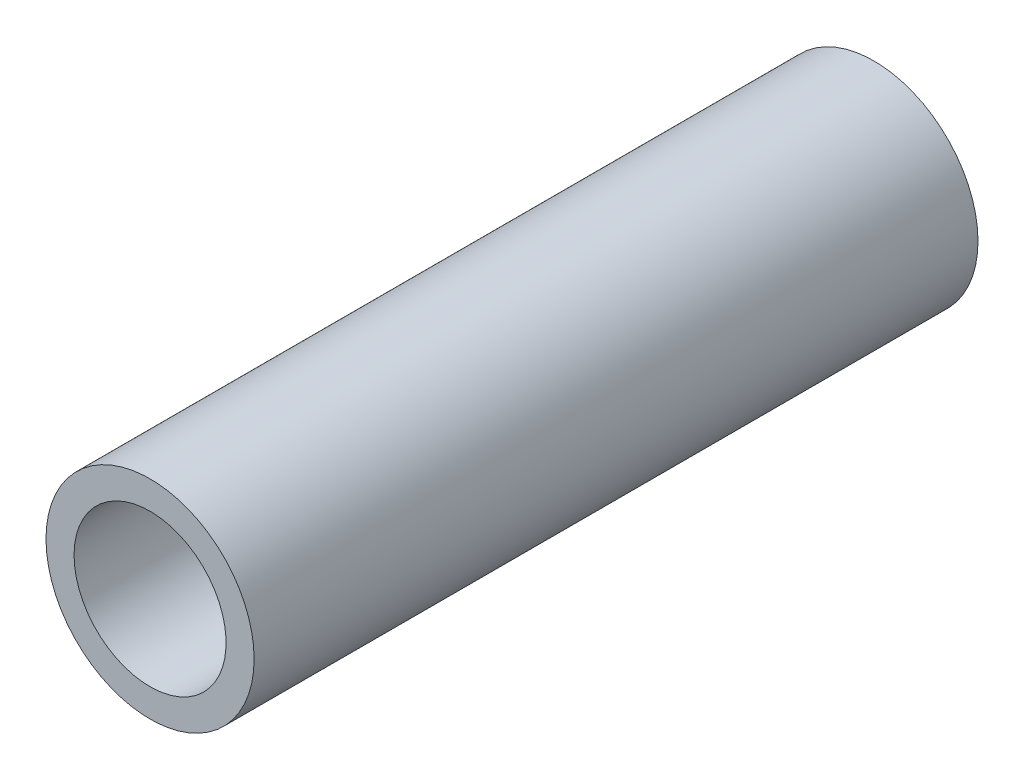
ISO-10303-21;
HEADER;
FILE_DESCRIPTION(('STEP AP214'),'2;1');
FILE_NAME('part.step','',(''),(''),'','','');
FILE_SCHEMA(('AUTOMOTIVE_DESIGN { 1 0 10303 214 1 1 1 1 }'));
ENDSEC;
DATA;
#1=APPLICATION_CONTEXT('core data for automotive mechanical design processes');
#2=APPLICATION_PROTOCOL_DEFINITION('international standard','automotive_design',2000,#1);
#3=PRODUCT_CONTEXT('',#1,'mechanical');
#4=PRODUCT('Part','Part','',(#3));
#5=PRODUCT_RELATED_PRODUCT_CATEGORY('part','',(#4));
#6=PRODUCT_DEFINITION_FORMATION('','',#4);
#7=PRODUCT_DEFINITION_CONTEXT('part definition',#1,'design');
#8=PRODUCT_DEFINITION('design','',#6,#7);
#9=PRODUCT_DEFINITION_SHAPE('','',#8);
#10=(LENGTH_UNIT() NAMED_UNIT(*) SI_UNIT(.MILLI.,.METRE.));
#11=(NAMED_UNIT(*) PLANE_ANGLE_UNIT() SI_UNIT($,.RADIAN.));
#12=(NAMED_UNIT(*) SI_UNIT($,.STERADIAN.) SOLID_ANGLE_UNIT());
#13=UNCERTAINTY_MEASURE_WITH_UNIT(LENGTH_MEASURE(1.E-05),#10,'distance_accuracy_value','');
#14=(GEOMETRIC_REPRESENTATION_CONTEXT(3) GLOBAL_UNCERTAINTY_ASSIGNED_CONTEXT((#13)) GLOBAL_UNIT_ASSIGNED_CONTEXT((#10,
#11,#12)) REPRESENTATION_CONTEXT('',''));
#15=CARTESIAN_POINT('',(0.,0.,0.));
#16=DIRECTION('',(0.,0.,1.));
#17=DIRECTION('',(1.,0.,0.));
#18=AXIS2_PLACEMENT_3D('',#15,#16,#17);
#19=CARTESIAN_POINT('',(0.,0.,-80.));
#20=DIRECTION('',(0.,0.,-1.));
#21=DIRECTION('',(-1.,0.,0.));
#22=AXIS2_PLACEMENT_3D('',#19,#20,#21);
#23=PLANE('',#22);
#24=CARTESIAN_POINT('',(0.,0.,-80.));
#25=DIRECTION('',(0.,0.,-1.));
#26=DIRECTION('',(-1.,0.,0.));
#27=AXIS2_PLACEMENT_3D('',#24,#25,#26);
#28=CIRCLE('',#27,5.75);
#29=CARTESIAN_POINT('',(-5.75,0.,-80.));
#30=VERTEX_POINT('',#29);
#31=EDGE_CURVE('E10',#30,#30,#28,.T.);
#32=ORIENTED_EDGE('',*,*,#31,.T.);
#33=EDGE_LOOP('',(#32));
#34=FACE_BOUND('',#33,.T.);
#35=CARTESIAN_POINT('',(0.,0.,-80.));
#36=DIRECTION('',(0.,0.,-1.));
#37=DIRECTION('',(-1.,0.,0.));
#38=AXIS2_PLACEMENT_3D('',#35,#36,#37);
#39=CIRCLE('',#38,4.2);
#40=CARTESIAN_POINT('',(-4.2,0.,-80.));
#41=VERTEX_POINT('',#40);
#42=EDGE_CURVE('E41',#41,#41,#39,.T.);
#43=ORIENTED_EDGE('',*,*,#42,.F.);
#44=EDGE_LOOP('',(#43));
#45=FACE_BOUND('',#44,.T.);
#46=ADVANCED_FACE('F30',(#34,#45),#23,.T.);
#47=CARTESIAN_POINT('',(0.,0.,-40.));
#48=DIRECTION('',(0.,0.,-1.));
#49=DIRECTION('',(-1.,0.,0.));
#50=AXIS2_PLACEMENT_3D('',#47,#48,#49);
#51=PLANE('',#50);
#52=CARTESIAN_POINT('',(0.,0.,-40.));
#53=DIRECTION('',(0.,0.,-1.));
#54=DIRECTION('',(-1.,0.,0.));
#55=AXIS2_PLACEMENT_3D('',#52,#53,#54);
#56=CIRCLE('',#55,5.75);
#57=CARTESIAN_POINT('',(-5.75,0.,-40.));
#58=VERTEX_POINT('',#57);
#59=EDGE_CURVE('E34',#58,#58,#56,.T.);
#60=ORIENTED_EDGE('',*,*,#59,.F.);
#61=EDGE_LOOP('',(#60));
#62=FACE_BOUND('',#61,.T.);
#63=CARTESIAN_POINT('',(0.,0.,-40.));
#64=DIRECTION('',(0.,0.,-1.));
#65=DIRECTION('',(-1.,0.,0.));
#66=AXIS2_PLACEMENT_3D('',#63,#64,#65);
#67=CIRCLE('',#66,4.2);
#68=CARTESIAN_POINT('',(-4.2,0.,-40.));
#69=VERTEX_POINT('',#68);
#70=EDGE_CURVE('E43',#69,#69,#67,.T.);
#71=ORIENTED_EDGE('',*,*,#70,.T.);
#72=EDGE_LOOP('',(#71));
#73=FACE_BOUND('',#72,.T.);
#74=ADVANCED_FACE('F53',(#62,#73),#51,.F.);
#75=CARTESIAN_POINT('',(0.,0.,-80.));
#76=DIRECTION('',(0.,0.,1.));
#77=DIRECTION('',(1.,0.,0.));
#78=AXIS2_PLACEMENT_3D('',#75,#76,#77);
#79=CYLINDRICAL_SURFACE('',#78,5.75);
#80=ORIENTED_EDGE('',*,*,#31,.F.);
#81=EDGE_LOOP('',(#80));
#82=FACE_BOUND('',#81,.T.);
#83=ORIENTED_EDGE('',*,*,#59,.T.);
#84=EDGE_LOOP('',(#83));
#85=FACE_BOUND('',#84,.T.);
#86=ADVANCED_FACE('F32',(#82,#85),#79,.T.);
#87=CARTESIAN_POINT('',(0.,0.,-80.));
#88=DIRECTION('',(0.,0.,1.));
#89=DIRECTION('',(1.,0.,0.));
#90=AXIS2_PLACEMENT_3D('',#87,#88,#89);
#91=CYLINDRICAL_SURFACE('',#90,4.2);
#92=ORIENTED_EDGE('',*,*,#42,.T.);
#93=EDGE_LOOP('',(#92));
#94=FACE_BOUND('',#93,.T.);
#95=ORIENTED_EDGE('',*,*,#70,.F.);
#96=EDGE_LOOP('',(#95));
#97=FACE_BOUND('',#96,.T.);
#98=ADVANCED_FACE('F49',(#94,#97),#91,.F.);
#99=CLOSED_SHELL('',(#46,#74,#86,#98));
#100=MANIFOLD_SOLID_BREP('B2',#99);
#101=ADVANCED_BREP_SHAPE_REPRESENTATION('',(#18,#100),#14);
#102=SHAPE_DEFINITION_REPRESENTATION(#9,#101);
ENDSEC;
END-ISO-10303-21;
